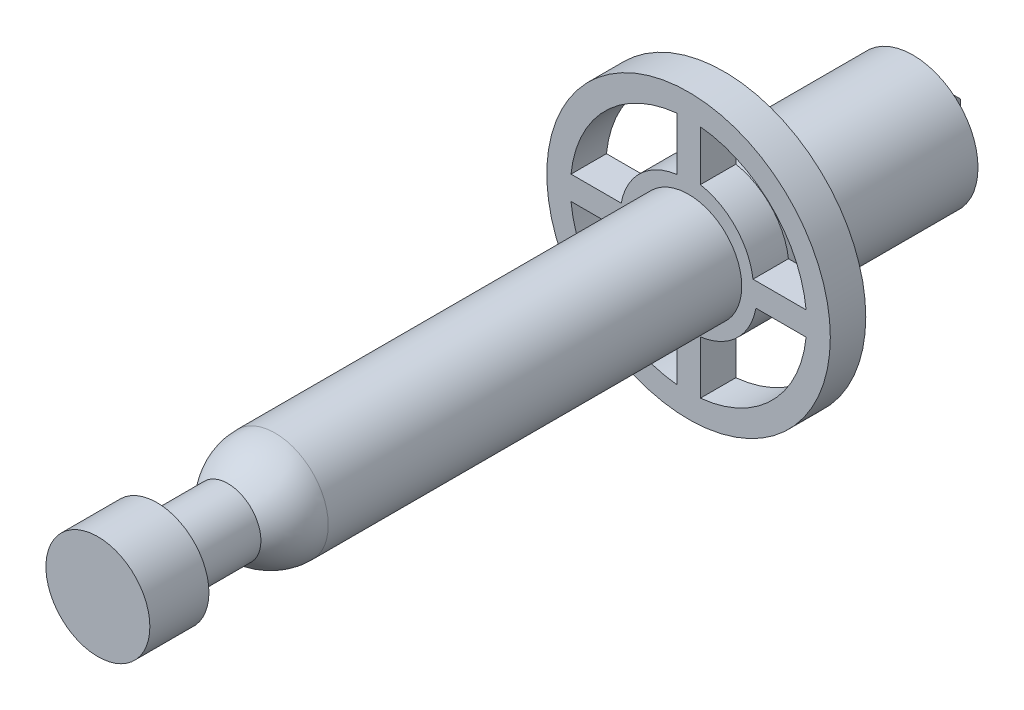
ISO-10303-21;
HEADER;
FILE_DESCRIPTION(('STEP AP214'),'2;1');
FILE_NAME('part.step','',(''),(''),'','','');
FILE_SCHEMA(('AUTOMOTIVE_DESIGN { 1 0 10303 214 1 1 1 1 }'));
ENDSEC;
DATA;
#1=APPLICATION_CONTEXT('core data for automotive mechanical design processes');
#2=APPLICATION_PROTOCOL_DEFINITION('international standard','automotive_design',2000,#1);
#3=PRODUCT_CONTEXT('',#1,'mechanical');
#4=PRODUCT('Part','Part','',(#3));
#5=PRODUCT_RELATED_PRODUCT_CATEGORY('part','',(#4));
#6=PRODUCT_DEFINITION_FORMATION('','',#4);
#7=PRODUCT_DEFINITION_CONTEXT('part definition',#1,'design');
#8=PRODUCT_DEFINITION('design','',#6,#7);
#9=PRODUCT_DEFINITION_SHAPE('','',#8);
#10=(LENGTH_UNIT() NAMED_UNIT(*) SI_UNIT(.MILLI.,.METRE.));
#11=(NAMED_UNIT(*) PLANE_ANGLE_UNIT() SI_UNIT($,.RADIAN.));
#12=(NAMED_UNIT(*) SI_UNIT($,.STERADIAN.) SOLID_ANGLE_UNIT());
#13=UNCERTAINTY_MEASURE_WITH_UNIT(LENGTH_MEASURE(1.E-05),#10,'distance_accuracy_value','');
#14=(GEOMETRIC_REPRESENTATION_CONTEXT(3) GLOBAL_UNCERTAINTY_ASSIGNED_CONTEXT((#13)) GLOBAL_UNIT_ASSIGNED_CONTEXT((#10,
#11,#12)) REPRESENTATION_CONTEXT('',''));
#15=CARTESIAN_POINT('',(0.,0.,0.));
#16=DIRECTION('',(0.,0.,1.));
#17=DIRECTION('',(1.,0.,0.));
#18=AXIS2_PLACEMENT_3D('',#15,#16,#17);
#19=CARTESIAN_POINT('',(0.,-0.14731535523065,8.));
#20=DIRECTION('',(0.,0.,-1.));
#21=DIRECTION('',(-1.,0.,0.));
#22=AXIS2_PLACEMENT_3D('',#19,#20,#21);
#23=CYLINDRICAL_SURFACE('',#22,2.75);
#24=CARTESIAN_POINT('',(0.,-0.14731535523065,8.));
#25=DIRECTION('',(0.,0.,1.));
#26=DIRECTION('',(1.,0.,0.));
#27=AXIS2_PLACEMENT_3D('',#24,#25,#26);
#28=CIRCLE('',#27,2.75);
#29=CARTESIAN_POINT('',(-0.499999999999999,-2.85147881182864,8.));
#30=VERTEX_POINT('',#29);
#31=CARTESIAN_POINT('',(0.50000000000001,-2.85147881182864,8.));
#32=VERTEX_POINT('',#31);
#33=EDGE_CURVE('E367',#30,#32,#28,.T.);
#34=ORIENTED_EDGE('',*,*,#33,.F.);
#35=DIRECTION('',(0.,0.,-1.));
#36=VECTOR('',#35,1.);
#37=CARTESIAN_POINT('',(-0.499999999999999,-2.85147881182864,9.5));
#38=LINE('',#37,#36);
#39=CARTESIAN_POINT('',(-0.499999999999999,-2.85147881182864,9.5));
#40=VERTEX_POINT('',#39);
#41=EDGE_CURVE('E336',#40,#30,#38,.T.);
#42=ORIENTED_EDGE('',*,*,#41,.F.);
#43=CARTESIAN_POINT('',(0.,-0.14731535523065,9.5));
#44=DIRECTION('',(0.,0.,-1.));
#45=DIRECTION('',(-1.,0.,0.));
#46=AXIS2_PLACEMENT_3D('',#43,#44,#45);
#47=CIRCLE('',#46,2.75);
#48=CARTESIAN_POINT('',(-2.72729051282476,-0.5,9.5));
#49=VERTEX_POINT('',#48);
#50=EDGE_CURVE('E322',#49,#40,#47,.F.);
#51=ORIENTED_EDGE('',*,*,#50,.F.);
#52=DIRECTION('',(0.,0.,-1.));
#53=VECTOR('',#52,1.);
#54=CARTESIAN_POINT('',(-2.72729051282476,-0.5,9.5));
#55=LINE('',#54,#53);
#56=CARTESIAN_POINT('',(-2.72729051282476,-0.5,8.));
#57=VERTEX_POINT('',#56);
#58=EDGE_CURVE('E340',#49,#57,#55,.T.);
#59=ORIENTED_EDGE('',*,*,#58,.T.);
#60=CARTESIAN_POINT('',(2.01680577967248,-2.01680577967247,8.));
#61=VERTEX_POINT('',#60);
#62=EDGE_CURVE('E372',#61,#57,#28,.T.);
#63=ORIENTED_EDGE('',*,*,#62,.F.);
#64=EDGE_CURVE('E371',#32,#61,#28,.T.);
#65=ORIENTED_EDGE('',*,*,#64,.F.);
#66=EDGE_LOOP('',(#34,#42,#51,#59,#63,#65));
#67=FACE_BOUND('',#66,.T.);
#68=CARTESIAN_POINT('',(0.,-0.14731535523065,0.));
#69=DIRECTION('',(0.,0.,1.));
#70=DIRECTION('',(1.,0.,0.));
#71=AXIS2_PLACEMENT_3D('',#68,#69,#70);
#72=CIRCLE('',#71,2.75);
#73=CARTESIAN_POINT('',(2.75,-0.14731535523065,0.));
#74=VERTEX_POINT('',#73);
#75=EDGE_CURVE('E366',#74,#74,#72,.T.);
#76=ORIENTED_EDGE('',*,*,#75,.T.);
#77=EDGE_LOOP('',(#76));
#78=FACE_BOUND('',#77,.T.);
#79=ADVANCED_FACE('F42',(#67,#78),#23,.T.);
#80=CARTESIAN_POINT('',(0.,-0.14731535523065,0.));
#81=DIRECTION('',(0.,0.,1.));
#82=DIRECTION('',(1.,0.,0.));
#83=AXIS2_PLACEMENT_3D('',#80,#81,#82);
#84=PLANE('',#83);
#85=CARTESIAN_POINT('',(0.,0.,0.));
#86=DIRECTION('',(0.,0.,1.));
#87=DIRECTION('',(1.,0.,0.));
#88=AXIS2_PLACEMENT_3D('',#85,#86,#87);
#89=CIRCLE('',#88,2.);
#90=CARTESIAN_POINT('',(2.,0.,0.));
#91=VERTEX_POINT('',#90);
#92=EDGE_CURVE('E362',#91,#91,#89,.T.);
#93=ORIENTED_EDGE('',*,*,#92,.T.);
#94=EDGE_LOOP('',(#93));
#95=FACE_BOUND('',#94,.T.);
#96=ORIENTED_EDGE('',*,*,#75,.F.);
#97=EDGE_LOOP('',(#96));
#98=FACE_BOUND('',#97,.T.);
#99=ADVANCED_FACE('F423',(#95,#98),#84,.F.);
#100=CARTESIAN_POINT('',(0.,0.,-2.));
#101=DIRECTION('',(0.,0.,1.));
#102=DIRECTION('',(1.,0.,0.));
#103=AXIS2_PLACEMENT_3D('',#100,#101,#102);
#104=CONICAL_SURFACE('',#103,0.,0.785398163397448);
#105=ORIENTED_EDGE('',*,*,#92,.F.);
#106=EDGE_LOOP('',(#105));
#107=FACE_BOUND('',#106,.T.);
#108=CARTESIAN_POINT('',(0.,0.,-2.));
#109=VERTEX_POINT('',#108);
#110=VERTEX_LOOP('',#109);
#111=FACE_BOUND('',#110,.T.);
#112=ADVANCED_FACE('F427',(#107,#111),#104,.T.);
#113=CARTESIAN_POINT('',(0.,0.,9.5));
#114=DIRECTION('',(0.,0.,-1.));
#115=DIRECTION('',(-1.,0.,0.));
#116=AXIS2_PLACEMENT_3D('',#113,#114,#115);
#117=CYLINDRICAL_SURFACE('',#116,6.);
#118=CARTESIAN_POINT('',(0.,0.,9.5));
#119=DIRECTION('',(0.,0.,1.));
#120=DIRECTION('',(1.,0.,0.));
#121=AXIS2_PLACEMENT_3D('',#118,#119,#120);
#122=CIRCLE('',#121,6.);
#123=CARTESIAN_POINT('',(6.,0.,9.5));
#124=VERTEX_POINT('',#123);
#125=EDGE_CURVE('E350',#124,#124,#122,.T.);
#126=ORIENTED_EDGE('',*,*,#125,.F.);
#127=EDGE_LOOP('',(#126));
#128=FACE_BOUND('',#127,.T.);
#129=CARTESIAN_POINT('',(0.,0.,8.));
#130=DIRECTION('',(0.,0.,1.));
#131=DIRECTION('',(1.,0.,0.));
#132=AXIS2_PLACEMENT_3D('',#129,#130,#131);
#133=CIRCLE('',#132,6.);
#134=CARTESIAN_POINT('',(6.,0.,8.));
#135=VERTEX_POINT('',#134);
#136=EDGE_CURVE('E339',#135,#135,#133,.T.);
#137=ORIENTED_EDGE('',*,*,#136,.T.);
#138=EDGE_LOOP('',(#137));
#139=FACE_BOUND('',#138,.T.);
#140=ADVANCED_FACE('F432',(#128,#139),#117,.T.);
#141=CARTESIAN_POINT('',(0.,0.,9.5));
#142=DIRECTION('',(0.,0.,1.));
#143=DIRECTION('',(1.,0.,0.));
#144=AXIS2_PLACEMENT_3D('',#141,#142,#143);
#145=PLANE('',#144);
#146=DIRECTION('',(1.,0.,0.));
#147=VECTOR('',#146,1.);
#148=CARTESIAN_POINT('',(0.,-0.499999999999999,9.5));
#149=LINE('',#148,#147);
#150=CARTESIAN_POINT('',(2.85147881182864,-0.499999999999989,9.5));
#151=VERTEX_POINT('',#150);
#152=CARTESIAN_POINT('',(4.9749371855331,-0.499999999999981,9.5));
#153=VERTEX_POINT('',#152);
#154=EDGE_CURVE('E170',#151,#153,#149,.T.);
#155=ORIENTED_EDGE('',*,*,#154,.T.);
#156=CARTESIAN_POINT('',(0.,0.,9.5));
#157=DIRECTION('',(0.,0.,-1.));
#158=DIRECTION('',(0.,-1.,0.));
#159=AXIS2_PLACEMENT_3D('',#156,#157,#158);
#160=CIRCLE('',#159,5.);
#161=CARTESIAN_POINT('',(0.500000000000017,-4.9749371855331,9.5));
#162=VERTEX_POINT('',#161);
#163=EDGE_CURVE('E179',#153,#162,#160,.T.);
#164=ORIENTED_EDGE('',*,*,#163,.T.);
#165=DIRECTION('',(0.,-1.,0.));
#166=VECTOR('',#165,1.);
#167=CARTESIAN_POINT('',(0.5,0.,9.5));
#168=LINE('',#167,#166);
#169=CARTESIAN_POINT('',(0.50000000000001,-2.72729051282475,9.5));
#170=VERTEX_POINT('',#169);
#171=EDGE_CURVE('E184',#170,#162,#168,.T.);
#172=ORIENTED_EDGE('',*,*,#171,.F.);
#173=CARTESIAN_POINT('',(0.14731535523065,0.,9.5));
#174=DIRECTION('',(0.,0.,-1.));
#175=DIRECTION('',(0.,-1.,0.));
#176=AXIS2_PLACEMENT_3D('',#173,#174,#175);
#177=CIRCLE('',#176,2.75);
#178=EDGE_CURVE('E176',#170,#151,#177,.F.);
#179=ORIENTED_EDGE('',*,*,#178,.T.);
#180=EDGE_LOOP('',(#155,#164,#172,#179));
#181=FACE_BOUND('',#180,.T.);
#182=DIRECTION('',(0.,1.,0.));
#183=VECTOR('',#182,1.);
#184=CARTESIAN_POINT('',(0.499999999999999,0.,9.5));
#185=LINE('',#184,#183);
#186=CARTESIAN_POINT('',(0.499999999999999,2.85147881182864,9.5));
#187=VERTEX_POINT('',#186);
#188=CARTESIAN_POINT('',(0.499999999999999,4.9749371855331,9.5));
#189=VERTEX_POINT('',#188);
#190=EDGE_CURVE('E224',#187,#189,#185,.T.);
#191=ORIENTED_EDGE('',*,*,#190,.T.);
#192=CARTESIAN_POINT('',(0.,0.,9.5));
#193=DIRECTION('',(0.,0.,-1.));
#194=DIRECTION('',(1.,0.,0.));
#195=AXIS2_PLACEMENT_3D('',#192,#193,#194);
#196=CIRCLE('',#195,5.);
#197=CARTESIAN_POINT('',(4.9749371855331,0.5,9.5));
#198=VERTEX_POINT('',#197);
#199=EDGE_CURVE('E228',#189,#198,#196,.T.);
#200=ORIENTED_EDGE('',*,*,#199,.T.);
#201=DIRECTION('',(1.,0.,0.));
#202=VECTOR('',#201,1.);
#203=CARTESIAN_POINT('',(0.,0.5,9.5));
#204=LINE('',#203,#202);
#205=CARTESIAN_POINT('',(2.72729051282476,0.5,9.5));
#206=VERTEX_POINT('',#205);
#207=EDGE_CURVE('E233',#206,#198,#204,.T.);
#208=ORIENTED_EDGE('',*,*,#207,.F.);
#209=CARTESIAN_POINT('',(0.,0.14731535523065,9.5));
#210=DIRECTION('',(0.,0.,-1.));
#211=DIRECTION('',(1.,0.,0.));
#212=AXIS2_PLACEMENT_3D('',#209,#210,#211);
#213=CIRCLE('',#212,2.75);
#214=EDGE_CURVE('E236',#206,#187,#213,.F.);
#215=ORIENTED_EDGE('',*,*,#214,.T.);
#216=EDGE_LOOP('',(#191,#200,#208,#215));
#217=FACE_BOUND('',#216,.T.);
#218=DIRECTION('',(-1.,0.,0.));
#219=VECTOR('',#218,1.);
#220=CARTESIAN_POINT('',(0.,0.499999999999999,9.5));
#221=LINE('',#220,#219);
#222=CARTESIAN_POINT('',(-2.85147881182865,0.499999999999969,9.5));
#223=VERTEX_POINT('',#222);
#224=CARTESIAN_POINT('',(-4.97493718553311,0.499999999999947,9.5));
#225=VERTEX_POINT('',#224);
#226=EDGE_CURVE('E265',#223,#225,#221,.T.);
#227=ORIENTED_EDGE('',*,*,#226,.T.);
#228=CARTESIAN_POINT('',(0.,0.,9.5));
#229=DIRECTION('',(0.,0.,-1.));
#230=DIRECTION('',(0.,1.,0.));
#231=AXIS2_PLACEMENT_3D('',#228,#229,#230);
#232=CIRCLE('',#231,5.);
#233=CARTESIAN_POINT('',(-0.500000000000052,4.9749371855331,9.5));
#234=VERTEX_POINT('',#233);
#235=EDGE_CURVE('E269',#225,#234,#232,.T.);
#236=ORIENTED_EDGE('',*,*,#235,.T.);
#237=DIRECTION('',(0.,1.,0.));
#238=VECTOR('',#237,1.);
#239=CARTESIAN_POINT('',(-0.5,0.,9.5));
#240=LINE('',#239,#238);
#241=CARTESIAN_POINT('',(-0.500000000000029,2.72729051282475,9.5));
#242=VERTEX_POINT('',#241);
#243=EDGE_CURVE('E274',#242,#234,#240,.T.);
#244=ORIENTED_EDGE('',*,*,#243,.F.);
#245=CARTESIAN_POINT('',(-0.14731535523065,0.,9.5));
#246=DIRECTION('',(0.,0.,-1.));
#247=DIRECTION('',(0.,1.,0.));
#248=AXIS2_PLACEMENT_3D('',#245,#246,#247);
#249=CIRCLE('',#248,2.75);
#250=EDGE_CURVE('E278',#242,#223,#249,.F.);
#251=ORIENTED_EDGE('',*,*,#250,.T.);
#252=EDGE_LOOP('',(#227,#236,#244,#251));
#253=FACE_BOUND('',#252,.T.);
#254=DIRECTION('',(0.,-1.,0.));
#255=VECTOR('',#254,1.);
#256=CARTESIAN_POINT('',(-0.499999999999999,0.,9.5));
#257=LINE('',#256,#255);
#258=CARTESIAN_POINT('',(-0.499999999999999,-4.9749371855331,9.5));
#259=VERTEX_POINT('',#258);
#260=EDGE_CURVE('E309',#40,#259,#257,.T.);
#261=ORIENTED_EDGE('',*,*,#260,.T.);
#262=CARTESIAN_POINT('',(0.,0.,9.5));
#263=DIRECTION('',(0.,0.,-1.));
#264=DIRECTION('',(-1.,0.,0.));
#265=AXIS2_PLACEMENT_3D('',#262,#263,#264);
#266=CIRCLE('',#265,5.);
#267=CARTESIAN_POINT('',(-4.9749371855331,-0.5,9.5));
#268=VERTEX_POINT('',#267);
#269=EDGE_CURVE('E313',#259,#268,#266,.T.);
#270=ORIENTED_EDGE('',*,*,#269,.T.);
#271=DIRECTION('',(-1.,0.,0.));
#272=VECTOR('',#271,1.);
#273=CARTESIAN_POINT('',(0.,-0.5,9.5));
#274=LINE('',#273,#272);
#275=EDGE_CURVE('E318',#49,#268,#274,.T.);
#276=ORIENTED_EDGE('',*,*,#275,.F.);
#277=ORIENTED_EDGE('',*,*,#50,.T.);
#278=EDGE_LOOP('',(#261,#270,#276,#277));
#279=FACE_BOUND('',#278,.T.);
#280=CARTESIAN_POINT('',(0.,0.,9.5));
#281=DIRECTION('',(0.,0.,1.));
#282=DIRECTION('',(1.,0.,0.));
#283=AXIS2_PLACEMENT_3D('',#280,#281,#282);
#284=CIRCLE('',#283,2.25);
#285=CARTESIAN_POINT('',(2.25,0.,9.5));
#286=VERTEX_POINT('',#285);
#287=EDGE_CURVE('E354',#286,#286,#284,.T.);
#288=ORIENTED_EDGE('',*,*,#287,.F.);
#289=EDGE_LOOP('',(#288));
#290=FACE_BOUND('',#289,.T.);
#291=ORIENTED_EDGE('',*,*,#125,.T.);
#292=EDGE_LOOP('',(#291));
#293=FACE_BOUND('',#292,.T.);
#294=ADVANCED_FACE('F186',(#181,#217,#253,#279,#290,#293),#145,.T.);
#295=CARTESIAN_POINT('',(0.,0.,8.));
#296=DIRECTION('',(0.,0.,1.));
#297=DIRECTION('',(1.,0.,0.));
#298=AXIS2_PLACEMENT_3D('',#295,#296,#297);
#299=PLANE('',#298);
#300=DIRECTION('',(1.,0.,0.));
#301=VECTOR('',#300,1.);
#302=CARTESIAN_POINT('',(0.,-0.499999999999999,8.));
#303=LINE('',#302,#301);
#304=CARTESIAN_POINT('',(2.85147881182864,-0.499999999999989,8.));
#305=VERTEX_POINT('',#304);
#306=CARTESIAN_POINT('',(4.9749371855331,-0.499999999999981,8.));
#307=VERTEX_POINT('',#306);
#308=EDGE_CURVE('E173',#305,#307,#303,.T.);
#309=ORIENTED_EDGE('',*,*,#308,.F.);
#310=CARTESIAN_POINT('',(0.14731535523065,0.,8.));
#311=DIRECTION('',(0.,0.,1.));
#312=DIRECTION('',(1.,0.,0.));
#313=AXIS2_PLACEMENT_3D('',#310,#311,#312);
#314=CIRCLE('',#313,2.75);
#315=EDGE_CURVE('E11',#305,#61,#314,.F.);
#316=ORIENTED_EDGE('',*,*,#315,.T.);
#317=ORIENTED_EDGE('',*,*,#62,.T.);
#318=DIRECTION('',(-1.,0.,0.));
#319=VECTOR('',#318,1.);
#320=CARTESIAN_POINT('',(0.,-0.5,8.));
#321=LINE('',#320,#319);
#322=CARTESIAN_POINT('',(-4.9749371855331,-0.5,8.));
#323=VERTEX_POINT('',#322);
#324=EDGE_CURVE('E314',#57,#323,#321,.T.);
#325=ORIENTED_EDGE('',*,*,#324,.T.);
#326=CARTESIAN_POINT('',(0.,0.,8.));
#327=DIRECTION('',(0.,0.,-1.));
#328=DIRECTION('',(-1.,0.,0.));
#329=AXIS2_PLACEMENT_3D('',#326,#327,#328);
#330=CIRCLE('',#329,5.);
#331=CARTESIAN_POINT('',(-0.499999999999999,-4.9749371855331,8.));
#332=VERTEX_POINT('',#331);
#333=EDGE_CURVE('E329',#332,#323,#330,.T.);
#334=ORIENTED_EDGE('',*,*,#333,.F.);
#335=DIRECTION('',(0.,-1.,0.));
#336=VECTOR('',#335,1.);
#337=CARTESIAN_POINT('',(-0.499999999999999,0.,8.));
#338=LINE('',#337,#336);
#339=EDGE_CURVE('E218',#30,#332,#338,.T.);
#340=ORIENTED_EDGE('',*,*,#339,.F.);
#341=ORIENTED_EDGE('',*,*,#33,.T.);
#342=DIRECTION('',(0.,1.,0.));
#343=VECTOR('',#342,1.);
#344=CARTESIAN_POINT('',(0.5,0.,8.));
#345=LINE('',#344,#343);
#346=CARTESIAN_POINT('',(0.500000000000017,-4.9749371855331,8.));
#347=VERTEX_POINT('',#346);
#348=EDGE_CURVE('E50',#347,#32,#345,.T.);
#349=ORIENTED_EDGE('',*,*,#348,.F.);
#350=CARTESIAN_POINT('',(0.,0.,8.));
#351=DIRECTION('',(0.,0.,-1.));
#352=DIRECTION('',(0.,-1.,0.));
#353=AXIS2_PLACEMENT_3D('',#350,#351,#352);
#354=CIRCLE('',#353,5.);
#355=EDGE_CURVE('E208',#307,#347,#354,.T.);
#356=ORIENTED_EDGE('',*,*,#355,.F.);
#357=EDGE_LOOP('',(#309,#316,#317,#325,#334,#340,#341,#349,#356));
#358=FACE_BOUND('',#357,.T.);
#359=CARTESIAN_POINT('',(0.,0.,8.));
#360=DIRECTION('',(0.,0.,-1.));
#361=DIRECTION('',(1.,0.,0.));
#362=AXIS2_PLACEMENT_3D('',#359,#360,#361);
#363=CIRCLE('',#362,5.);
#364=CARTESIAN_POINT('',(0.499999999999999,4.9749371855331,8.));
#365=VERTEX_POINT('',#364);
#366=CARTESIAN_POINT('',(4.9749371855331,0.5,8.));
#367=VERTEX_POINT('',#366);
#368=EDGE_CURVE('E244',#365,#367,#363,.T.);
#369=ORIENTED_EDGE('',*,*,#368,.F.);
#370=DIRECTION('',(0.,1.,0.));
#371=VECTOR('',#370,1.);
#372=CARTESIAN_POINT('',(0.499999999999999,0.,8.));
#373=LINE('',#372,#371);
#374=CARTESIAN_POINT('',(0.499999999999999,2.85147881182864,8.));
#375=VERTEX_POINT('',#374);
#376=EDGE_CURVE('E241',#375,#365,#373,.T.);
#377=ORIENTED_EDGE('',*,*,#376,.F.);
#378=CARTESIAN_POINT('',(0.,0.14731535523065,8.));
#379=DIRECTION('',(0.,0.,-1.));
#380=DIRECTION('',(1.,0.,0.));
#381=AXIS2_PLACEMENT_3D('',#378,#379,#380);
#382=CIRCLE('',#381,2.75);
#383=CARTESIAN_POINT('',(2.72729051282476,0.5,8.));
#384=VERTEX_POINT('',#383);
#385=EDGE_CURVE('E229',#384,#375,#382,.F.);
#386=ORIENTED_EDGE('',*,*,#385,.F.);
#387=DIRECTION('',(1.,0.,0.));
#388=VECTOR('',#387,1.);
#389=CARTESIAN_POINT('',(0.,0.5,8.));
#390=LINE('',#389,#388);
#391=EDGE_CURVE('E248',#384,#367,#390,.T.);
#392=ORIENTED_EDGE('',*,*,#391,.T.);
#393=EDGE_LOOP('',(#369,#377,#386,#392));
#394=FACE_BOUND('',#393,.T.);
#395=CARTESIAN_POINT('',(0.,0.,8.));
#396=DIRECTION('',(0.,0.,-1.));
#397=DIRECTION('',(0.,1.,0.));
#398=AXIS2_PLACEMENT_3D('',#395,#396,#397);
#399=CIRCLE('',#398,5.);
#400=CARTESIAN_POINT('',(-4.97493718553311,0.499999999999947,8.));
#401=VERTEX_POINT('',#400);
#402=CARTESIAN_POINT('',(-0.500000000000052,4.9749371855331,8.));
#403=VERTEX_POINT('',#402);
#404=EDGE_CURVE('E286',#401,#403,#399,.T.);
#405=ORIENTED_EDGE('',*,*,#404,.F.);
#406=DIRECTION('',(-1.,0.,0.));
#407=VECTOR('',#406,1.);
#408=CARTESIAN_POINT('',(0.,0.499999999999999,8.));
#409=LINE('',#408,#407);
#410=CARTESIAN_POINT('',(-2.85147881182865,0.499999999999969,8.));
#411=VERTEX_POINT('',#410);
#412=EDGE_CURVE('E283',#411,#401,#409,.T.);
#413=ORIENTED_EDGE('',*,*,#412,.F.);
#414=CARTESIAN_POINT('',(-0.14731535523065,0.,8.));
#415=DIRECTION('',(0.,0.,-1.));
#416=DIRECTION('',(0.,1.,0.));
#417=AXIS2_PLACEMENT_3D('',#414,#415,#416);
#418=CIRCLE('',#417,2.75);
#419=CARTESIAN_POINT('',(-0.500000000000029,2.72729051282475,8.));
#420=VERTEX_POINT('',#419);
#421=EDGE_CURVE('E270',#420,#411,#418,.F.);
#422=ORIENTED_EDGE('',*,*,#421,.F.);
#423=DIRECTION('',(0.,1.,0.));
#424=VECTOR('',#423,1.);
#425=CARTESIAN_POINT('',(-0.5,0.,8.));
#426=LINE('',#425,#424);
#427=EDGE_CURVE('E291',#420,#403,#426,.T.);
#428=ORIENTED_EDGE('',*,*,#427,.T.);
#429=EDGE_LOOP('',(#405,#413,#422,#428));
#430=FACE_BOUND('',#429,.T.);
#431=ORIENTED_EDGE('',*,*,#136,.F.);
#432=EDGE_LOOP('',(#431));
#433=FACE_BOUND('',#432,.T.);
#434=ADVANCED_FACE('F394',(#358,#394,#430,#433),#299,.F.);
#435=CARTESIAN_POINT('',(0.,0.,27.));
#436=DIRECTION('',(0.,0.,-1.));
#437=DIRECTION('',(-1.,0.,0.));
#438=AXIS2_PLACEMENT_3D('',#435,#436,#437);
#439=CYLINDRICAL_SURFACE('',#438,2.25);
#440=ORIENTED_EDGE('',*,*,#287,.T.);
#441=EDGE_LOOP('',(#440));
#442=FACE_BOUND('',#441,.T.);
#443=CARTESIAN_POINT('',(0.,0.,27.));
#444=DIRECTION('',(0.,0.,1.));
#445=DIRECTION('',(1.,0.,0.));
#446=AXIS2_PLACEMENT_3D('',#443,#444,#445);
#447=CIRCLE('',#446,2.25);
#448=CARTESIAN_POINT('',(2.25,0.,27.));
#449=VERTEX_POINT('',#448);
#450=EDGE_CURVE('E358',#449,#449,#447,.T.);
#451=ORIENTED_EDGE('',*,*,#450,.F.);
#452=EDGE_LOOP('',(#451));
#453=FACE_BOUND('',#452,.T.);
#454=ADVANCED_FACE('F437',(#442,#453),#439,.T.);
#455=CARTESIAN_POINT('',(-0.499999999999999,0.,9.5));
#456=DIRECTION('',(1.,0.,0.));
#457=DIRECTION('',(0.,1.,0.));
#458=AXIS2_PLACEMENT_3D('',#455,#456,#457);
#459=PLANE('',#458);
#460=ORIENTED_EDGE('',*,*,#339,.T.);
#461=DIRECTION('',(0.,0.,-1.));
#462=VECTOR('',#461,1.);
#463=CARTESIAN_POINT('',(-0.499999999999999,-4.9749371855331,9.5));
#464=LINE('',#463,#462);
#465=EDGE_CURVE('E326',#259,#332,#464,.T.);
#466=ORIENTED_EDGE('',*,*,#465,.F.);
#467=ORIENTED_EDGE('',*,*,#260,.F.);
#468=ORIENTED_EDGE('',*,*,#41,.T.);
#469=EDGE_LOOP('',(#460,#466,#467,#468));
#470=FACE_BOUND('',#469,.T.);
#471=ADVANCED_FACE('F398',(#470),#459,.F.);
#472=CARTESIAN_POINT('',(0.,-0.5,9.5));
#473=DIRECTION('',(0.,-1.,0.));
#474=DIRECTION('',(1.,0.,0.));
#475=AXIS2_PLACEMENT_3D('',#472,#473,#474);
#476=PLANE('',#475);
#477=ORIENTED_EDGE('',*,*,#324,.F.);
#478=ORIENTED_EDGE('',*,*,#58,.F.);
#479=ORIENTED_EDGE('',*,*,#275,.T.);
#480=DIRECTION('',(0.,0.,-1.));
#481=VECTOR('',#480,1.);
#482=CARTESIAN_POINT('',(-4.9749371855331,-0.5,9.5));
#483=LINE('',#482,#481);
#484=EDGE_CURVE('E344',#268,#323,#483,.T.);
#485=ORIENTED_EDGE('',*,*,#484,.T.);
#486=EDGE_LOOP('',(#477,#478,#479,#485));
#487=FACE_BOUND('',#486,.T.);
#488=ADVANCED_FACE('F409',(#487),#476,.T.);
#489=CARTESIAN_POINT('',(0.,0.,9.5));
#490=DIRECTION('',(0.,0.,-1.));
#491=DIRECTION('',(-1.,0.,0.));
#492=AXIS2_PLACEMENT_3D('',#489,#490,#491);
#493=CYLINDRICAL_SURFACE('',#492,5.);
#494=ORIENTED_EDGE('',*,*,#333,.T.);
#495=ORIENTED_EDGE('',*,*,#484,.F.);
#496=ORIENTED_EDGE('',*,*,#269,.F.);
#497=ORIENTED_EDGE('',*,*,#465,.T.);
#498=EDGE_LOOP('',(#494,#495,#496,#497));
#499=FACE_BOUND('',#498,.T.);
#500=ADVANCED_FACE('F402',(#499),#493,.F.);
#501=CARTESIAN_POINT('',(0.,0.499999999999999,9.5));
#502=DIRECTION('',(0.,-1.,0.));
#503=DIRECTION('',(1.,0.,0.));
#504=AXIS2_PLACEMENT_3D('',#501,#502,#503);
#505=PLANE('',#504);
#506=ORIENTED_EDGE('',*,*,#412,.T.);
#507=DIRECTION('',(0.,0.,-1.));
#508=VECTOR('',#507,1.);
#509=CARTESIAN_POINT('',(-4.97493718553311,0.499999999999947,9.5));
#510=LINE('',#509,#508);
#511=EDGE_CURVE('E282',#225,#401,#510,.T.);
#512=ORIENTED_EDGE('',*,*,#511,.F.);
#513=ORIENTED_EDGE('',*,*,#226,.F.);
#514=DIRECTION('',(0.,0.,-1.));
#515=VECTOR('',#514,1.);
#516=CARTESIAN_POINT('',(-2.85147881182865,0.499999999999969,9.5));
#517=LINE('',#516,#515);
#518=EDGE_CURVE('E245',#223,#411,#517,.T.);
#519=ORIENTED_EDGE('',*,*,#518,.T.);
#520=EDGE_LOOP('',(#506,#512,#513,#519));
#521=FACE_BOUND('',#520,.T.);
#522=ADVANCED_FACE('F452',(#521),#505,.F.);
#523=CARTESIAN_POINT('',(-0.14731535523065,0.,9.5));
#524=DIRECTION('',(0.,0.,-1.));
#525=DIRECTION('',(-1.,0.,0.));
#526=AXIS2_PLACEMENT_3D('',#523,#524,#525);
#527=CYLINDRICAL_SURFACE('',#526,2.75);
#528=ORIENTED_EDGE('',*,*,#421,.T.);
#529=ORIENTED_EDGE('',*,*,#518,.F.);
#530=ORIENTED_EDGE('',*,*,#250,.F.);
#531=DIRECTION('',(0.,0.,-1.));
#532=VECTOR('',#531,1.);
#533=CARTESIAN_POINT('',(-0.500000000000029,2.72729051282475,9.5));
#534=LINE('',#533,#532);
#535=EDGE_CURVE('E300',#242,#420,#534,.T.);
#536=ORIENTED_EDGE('',*,*,#535,.T.);
#537=EDGE_LOOP('',(#528,#529,#530,#536));
#538=FACE_BOUND('',#537,.T.);
#539=ADVANCED_FACE('F457',(#538),#527,.T.);
#540=CARTESIAN_POINT('',(-0.5,0.,9.5));
#541=DIRECTION('',(-1.,0.,0.));
#542=DIRECTION('',(0.,-1.,0.));
#543=AXIS2_PLACEMENT_3D('',#540,#541,#542);
#544=PLANE('',#543);
#545=ORIENTED_EDGE('',*,*,#427,.F.);
#546=ORIENTED_EDGE('',*,*,#535,.F.);
#547=ORIENTED_EDGE('',*,*,#243,.T.);
#548=DIRECTION('',(0.,0.,-1.));
#549=VECTOR('',#548,1.);
#550=CARTESIAN_POINT('',(-0.500000000000052,4.9749371855331,9.5));
#551=LINE('',#550,#549);
#552=EDGE_CURVE('E303',#234,#403,#551,.T.);
#553=ORIENTED_EDGE('',*,*,#552,.T.);
#554=EDGE_LOOP('',(#545,#546,#547,#553));
#555=FACE_BOUND('',#554,.T.);
#556=ADVANCED_FACE('F463',(#555),#544,.T.);
#557=CARTESIAN_POINT('',(0.,0.,9.5));
#558=DIRECTION('',(0.,0.,-1.));
#559=DIRECTION('',(-1.,0.,0.));
#560=AXIS2_PLACEMENT_3D('',#557,#558,#559);
#561=CYLINDRICAL_SURFACE('',#560,5.);
#562=ORIENTED_EDGE('',*,*,#404,.T.);
#563=ORIENTED_EDGE('',*,*,#552,.F.);
#564=ORIENTED_EDGE('',*,*,#235,.F.);
#565=ORIENTED_EDGE('',*,*,#511,.T.);
#566=EDGE_LOOP('',(#562,#563,#564,#565));
#567=FACE_BOUND('',#566,.T.);
#568=ADVANCED_FACE('F459',(#567),#561,.F.);
#569=CARTESIAN_POINT('',(0.499999999999999,0.,9.5));
#570=DIRECTION('',(-1.,0.,0.));
#571=DIRECTION('',(0.,-1.,0.));
#572=AXIS2_PLACEMENT_3D('',#569,#570,#571);
#573=PLANE('',#572);
#574=ORIENTED_EDGE('',*,*,#376,.T.);
#575=DIRECTION('',(0.,0.,-1.));
#576=VECTOR('',#575,1.);
#577=CARTESIAN_POINT('',(0.499999999999999,4.9749371855331,9.5));
#578=LINE('',#577,#576);
#579=EDGE_CURVE('E240',#189,#365,#578,.T.);
#580=ORIENTED_EDGE('',*,*,#579,.F.);
#581=ORIENTED_EDGE('',*,*,#190,.F.);
#582=DIRECTION('',(0.,0.,-1.));
#583=VECTOR('',#582,1.);
#584=CARTESIAN_POINT('',(0.499999999999999,2.85147881182864,9.5));
#585=LINE('',#584,#583);
#586=EDGE_CURVE('E209',#187,#375,#585,.T.);
#587=ORIENTED_EDGE('',*,*,#586,.T.);
#588=EDGE_LOOP('',(#574,#580,#581,#587));
#589=FACE_BOUND('',#588,.T.);
#590=ADVANCED_FACE('F462',(#589),#573,.F.);
#591=CARTESIAN_POINT('',(0.,0.14731535523065,9.5));
#592=DIRECTION('',(0.,0.,-1.));
#593=DIRECTION('',(-1.,0.,0.));
#594=AXIS2_PLACEMENT_3D('',#591,#592,#593);
#595=CYLINDRICAL_SURFACE('',#594,2.75);
#596=ORIENTED_EDGE('',*,*,#385,.T.);
#597=ORIENTED_EDGE('',*,*,#586,.F.);
#598=ORIENTED_EDGE('',*,*,#214,.F.);
#599=DIRECTION('',(0.,0.,-1.));
#600=VECTOR('',#599,1.);
#601=CARTESIAN_POINT('',(2.72729051282476,0.5,9.5));
#602=LINE('',#601,#600);
#603=EDGE_CURVE('E257',#206,#384,#602,.T.);
#604=ORIENTED_EDGE('',*,*,#603,.T.);
#605=EDGE_LOOP('',(#596,#597,#598,#604));
#606=FACE_BOUND('',#605,.T.);
#607=ADVANCED_FACE('F473',(#606),#595,.T.);
#608=CARTESIAN_POINT('',(0.,0.5,9.5));
#609=DIRECTION('',(0.,1.,0.));
#610=DIRECTION('',(-1.,0.,0.));
#611=AXIS2_PLACEMENT_3D('',#608,#609,#610);
#612=PLANE('',#611);
#613=ORIENTED_EDGE('',*,*,#391,.F.);
#614=ORIENTED_EDGE('',*,*,#603,.F.);
#615=ORIENTED_EDGE('',*,*,#207,.T.);
#616=DIRECTION('',(0.,0.,-1.));
#617=VECTOR('',#616,1.);
#618=CARTESIAN_POINT('',(4.9749371855331,0.5,9.5));
#619=LINE('',#618,#617);
#620=EDGE_CURVE('E65',#198,#367,#619,.T.);
#621=ORIENTED_EDGE('',*,*,#620,.T.);
#622=EDGE_LOOP('',(#613,#614,#615,#621));
#623=FACE_BOUND('',#622,.T.);
#624=ADVANCED_FACE('F478',(#623),#612,.T.);
#625=CARTESIAN_POINT('',(0.,0.,9.5));
#626=DIRECTION('',(0.,0.,-1.));
#627=DIRECTION('',(-1.,0.,0.));
#628=AXIS2_PLACEMENT_3D('',#625,#626,#627);
#629=CYLINDRICAL_SURFACE('',#628,5.);
#630=ORIENTED_EDGE('',*,*,#368,.T.);
#631=ORIENTED_EDGE('',*,*,#620,.F.);
#632=ORIENTED_EDGE('',*,*,#199,.F.);
#633=ORIENTED_EDGE('',*,*,#579,.T.);
#634=EDGE_LOOP('',(#630,#631,#632,#633));
#635=FACE_BOUND('',#634,.T.);
#636=ADVANCED_FACE('F475',(#635),#629,.F.);
#637=CARTESIAN_POINT('',(0.,0.,8.));
#638=DIRECTION('',(0.,0.,-1.));
#639=DIRECTION('',(0.,-1.,0.));
#640=AXIS2_PLACEMENT_3D('',#637,#638,#639);
#641=PLANE('',#640);
#642=CARTESIAN_POINT('',(0.14731535523065,0.,8.));
#643=DIRECTION('',(0.,0.,-1.));
#644=DIRECTION('',(0.,-1.,0.));
#645=AXIS2_PLACEMENT_3D('',#642,#643,#644);
#646=CIRCLE('',#645,2.75);
#647=CARTESIAN_POINT('',(0.50000000000001,-2.72729051282475,8.));
#648=VERTEX_POINT('',#647);
#649=EDGE_CURVE('E190',#648,#61,#646,.F.);
#650=ORIENTED_EDGE('',*,*,#649,.F.);
#651=DIRECTION('',(0.,-1.,0.));
#652=VECTOR('',#651,1.);
#653=CARTESIAN_POINT('',(0.5,0.,8.));
#654=LINE('',#653,#652);
#655=EDGE_CURVE('E194',#648,#32,#654,.T.);
#656=ORIENTED_EDGE('',*,*,#655,.T.);
#657=ORIENTED_EDGE('',*,*,#64,.T.);
#658=EDGE_LOOP('',(#650,#656,#657));
#659=FACE_BOUND('',#658,.T.);
#660=ADVANCED_FACE('F387',(#659),#641,.F.);
#661=CARTESIAN_POINT('',(0.,-0.499999999999999,9.5));
#662=DIRECTION('',(0.,1.,0.));
#663=DIRECTION('',(-1.,0.,0.));
#664=AXIS2_PLACEMENT_3D('',#661,#662,#663);
#665=PLANE('',#664);
#666=ORIENTED_EDGE('',*,*,#308,.T.);
#667=DIRECTION('',(0.,0.,-1.));
#668=VECTOR('',#667,1.);
#669=CARTESIAN_POINT('',(4.9749371855331,-0.499999999999981,9.5));
#670=LINE('',#669,#668);
#671=EDGE_CURVE('E166',#153,#307,#670,.T.);
#672=ORIENTED_EDGE('',*,*,#671,.F.);
#673=ORIENTED_EDGE('',*,*,#154,.F.);
#674=DIRECTION('',(0.,0.,-1.));
#675=VECTOR('',#674,1.);
#676=CARTESIAN_POINT('',(2.85147881182864,-0.499999999999989,9.5));
#677=LINE('',#676,#675);
#678=EDGE_CURVE('E215',#151,#305,#677,.T.);
#679=ORIENTED_EDGE('',*,*,#678,.T.);
#680=EDGE_LOOP('',(#666,#672,#673,#679));
#681=FACE_BOUND('',#680,.T.);
#682=ADVANCED_FACE('F167',(#681),#665,.F.);
#683=CARTESIAN_POINT('',(0.14731535523065,0.,9.5));
#684=DIRECTION('',(0.,0.,-1.));
#685=DIRECTION('',(-1.,0.,0.));
#686=AXIS2_PLACEMENT_3D('',#683,#684,#685);
#687=CYLINDRICAL_SURFACE('',#686,2.75);
#688=ORIENTED_EDGE('',*,*,#649,.T.);
#689=ORIENTED_EDGE('',*,*,#315,.F.);
#690=ORIENTED_EDGE('',*,*,#678,.F.);
#691=ORIENTED_EDGE('',*,*,#178,.F.);
#692=DIRECTION('',(0.,0.,-1.));
#693=VECTOR('',#692,1.);
#694=CARTESIAN_POINT('',(0.50000000000001,-2.72729051282475,9.5));
#695=LINE('',#694,#693);
#696=EDGE_CURVE('E219',#170,#648,#695,.T.);
#697=ORIENTED_EDGE('',*,*,#696,.T.);
#698=EDGE_LOOP('',(#688,#689,#690,#691,#697));
#699=FACE_BOUND('',#698,.T.);
#700=ADVANCED_FACE('F412',(#699),#687,.T.);
#701=CARTESIAN_POINT('',(0.5,0.,9.5));
#702=DIRECTION('',(1.,0.,0.));
#703=DIRECTION('',(0.,1.,0.));
#704=AXIS2_PLACEMENT_3D('',#701,#702,#703);
#705=PLANE('',#704);
#706=ORIENTED_EDGE('',*,*,#655,.F.);
#707=ORIENTED_EDGE('',*,*,#696,.F.);
#708=ORIENTED_EDGE('',*,*,#171,.T.);
#709=DIRECTION('',(0.,0.,-1.));
#710=VECTOR('',#709,1.);
#711=CARTESIAN_POINT('',(0.500000000000017,-4.9749371855331,9.5));
#712=LINE('',#711,#710);
#713=EDGE_CURVE('E57',#162,#347,#712,.T.);
#714=ORIENTED_EDGE('',*,*,#713,.T.);
#715=ORIENTED_EDGE('',*,*,#348,.T.);
#716=EDGE_LOOP('',(#706,#707,#708,#714,#715));
#717=FACE_BOUND('',#716,.T.);
#718=ADVANCED_FACE('F382',(#717),#705,.T.);
#719=CARTESIAN_POINT('',(0.,0.,9.5));
#720=DIRECTION('',(0.,0.,-1.));
#721=DIRECTION('',(-1.,0.,0.));
#722=AXIS2_PLACEMENT_3D('',#719,#720,#721);
#723=CYLINDRICAL_SURFACE('',#722,5.);
#724=ORIENTED_EDGE('',*,*,#355,.T.);
#725=ORIENTED_EDGE('',*,*,#713,.F.);
#726=ORIENTED_EDGE('',*,*,#163,.F.);
#727=ORIENTED_EDGE('',*,*,#671,.T.);
#728=EDGE_LOOP('',(#724,#725,#726,#727));
#729=FACE_BOUND('',#728,.T.);
#730=ADVANCED_FACE('F180',(#729),#723,.F.);
#731=CARTESIAN_POINT('',(0.,2.25,27.));
#732=CARTESIAN_POINT('',(0.,2.25,28.086565690605));
#733=CARTESIAN_POINT('',(0.,1.4,29.));
#734=B_SPLINE_CURVE_WITH_KNOTS('',2,(#731,#732,#733),.UNSPECIFIED.,.F.,.F.,(3,3),(0.,1.),.UNSPECIFIED.);
#735=CARTESIAN_POINT('',(0.,0.,27.));
#736=DIRECTION('',(0.,0.,-1.));
#737=AXIS1_PLACEMENT('',#735,#736);
#738=SURFACE_OF_REVOLUTION('',#734,#737);
#739=CARTESIAN_POINT('',(0.,0.,29.));
#740=DIRECTION('',(0.,0.,1.));
#741=DIRECTION('',(1.,0.,0.));
#742=AXIS2_PLACEMENT_3D('',#739,#740,#741);
#743=CIRCLE('',#742,1.4);
#744=CARTESIAN_POINT('',(1.4,0.,29.));
#745=VERTEX_POINT('',#744);
#746=EDGE_CURVE('E754',#745,#745,#743,.T.);
#747=ORIENTED_EDGE('',*,*,#746,.F.);
#748=EDGE_LOOP('',(#747));
#749=FACE_BOUND('',#748,.T.);
#750=ORIENTED_EDGE('',*,*,#450,.T.);
#751=EDGE_LOOP('',(#750));
#752=FACE_BOUND('',#751,.T.);
#753=ADVANCED_FACE('F486',(#749,#752),#738,.F.);
#754=CARTESIAN_POINT('',(0.,0.,32.));
#755=DIRECTION('',(0.,0.,-1.));
#756=DIRECTION('',(-1.,0.,0.));
#757=AXIS2_PLACEMENT_3D('',#754,#755,#756);
#758=CYLINDRICAL_SURFACE('',#757,1.4);
#759=CARTESIAN_POINT('',(0.,0.,32.));
#760=DIRECTION('',(0.,0.,1.));
#761=DIRECTION('',(1.,0.,0.));
#762=AXIS2_PLACEMENT_3D('',#759,#760,#761);
#763=CIRCLE('',#762,1.4);
#764=CARTESIAN_POINT('',(1.4,0.,32.));
#765=VERTEX_POINT('',#764);
#766=EDGE_CURVE('E287',#765,#765,#763,.T.);
#767=ORIENTED_EDGE('',*,*,#766,.F.);
#768=EDGE_LOOP('',(#767));
#769=FACE_BOUND('',#768,.T.);
#770=ORIENTED_EDGE('',*,*,#746,.T.);
#771=EDGE_LOOP('',(#770));
#772=FACE_BOUND('',#771,.T.);
#773=ADVANCED_FACE('F490',(#769,#772),#758,.T.);
#774=CARTESIAN_POINT('',(0.,0.,34.5));
#775=DIRECTION('',(0.,0.,-1.));
#776=DIRECTION('',(-1.,0.,0.));
#777=AXIS2_PLACEMENT_3D('',#774,#775,#776);
#778=CYLINDRICAL_SURFACE('',#777,2.2);
#779=CARTESIAN_POINT('',(0.,0.,34.5));
#780=DIRECTION('',(0.,0.,1.));
#781=DIRECTION('',(1.,0.,0.));
#782=AXIS2_PLACEMENT_3D('',#779,#780,#781);
#783=CIRCLE('',#782,2.2);
#784=CARTESIAN_POINT('',(2.2,0.,34.5));
#785=VERTEX_POINT('',#784);
#786=EDGE_CURVE('E750',#785,#785,#783,.T.);
#787=ORIENTED_EDGE('',*,*,#786,.F.);
#788=EDGE_LOOP('',(#787));
#789=FACE_BOUND('',#788,.T.);
#790=CARTESIAN_POINT('',(0.,0.,32.));
#791=DIRECTION('',(0.,0.,1.));
#792=DIRECTION('',(1.,0.,0.));
#793=AXIS2_PLACEMENT_3D('',#790,#791,#792);
#794=CIRCLE('',#793,2.2);
#795=CARTESIAN_POINT('',(2.2,0.,32.));
#796=VERTEX_POINT('',#795);
#797=EDGE_CURVE('E747',#796,#796,#794,.T.);
#798=ORIENTED_EDGE('',*,*,#797,.T.);
#799=EDGE_LOOP('',(#798));
#800=FACE_BOUND('',#799,.T.);
#801=ADVANCED_FACE('F496',(#789,#800),#778,.T.);
#802=CARTESIAN_POINT('',(0.,0.,34.5));
#803=DIRECTION('',(0.,0.,1.));
#804=DIRECTION('',(1.,0.,0.));
#805=AXIS2_PLACEMENT_3D('',#802,#803,#804);
#806=PLANE('',#805);
#807=ORIENTED_EDGE('',*,*,#786,.T.);
#808=EDGE_LOOP('',(#807));
#809=FACE_BOUND('',#808,.T.);
#810=ADVANCED_FACE('F550',(#809),#806,.T.);
#811=CARTESIAN_POINT('',(0.,0.,32.));
#812=DIRECTION('',(0.,0.,1.));
#813=DIRECTION('',(1.,0.,0.));
#814=AXIS2_PLACEMENT_3D('',#811,#812,#813);
#815=PLANE('',#814);
#816=ORIENTED_EDGE('',*,*,#766,.T.);
#817=EDGE_LOOP('',(#816));
#818=FACE_BOUND('',#817,.T.);
#819=ORIENTED_EDGE('',*,*,#797,.F.);
#820=EDGE_LOOP('',(#819));
#821=FACE_BOUND('',#820,.T.);
#822=ADVANCED_FACE('F560',(#818,#821),#815,.F.);
#823=CLOSED_SHELL('',(#79,#99,#112,#140,#294,#434,#454,#471,#488,#500,#522,#539,#556,#568,#590,
#607,#624,#636,#660,#682,#700,#718,#730,#753,#773,#801,#810,#822));
#824=MANIFOLD_SOLID_BREP('B2',#823);
#825=ADVANCED_BREP_SHAPE_REPRESENTATION('',(#18,#824),#14);
#826=SHAPE_DEFINITION_REPRESENTATION(#9,#825);
ENDSEC;
END-ISO-10303-21;
